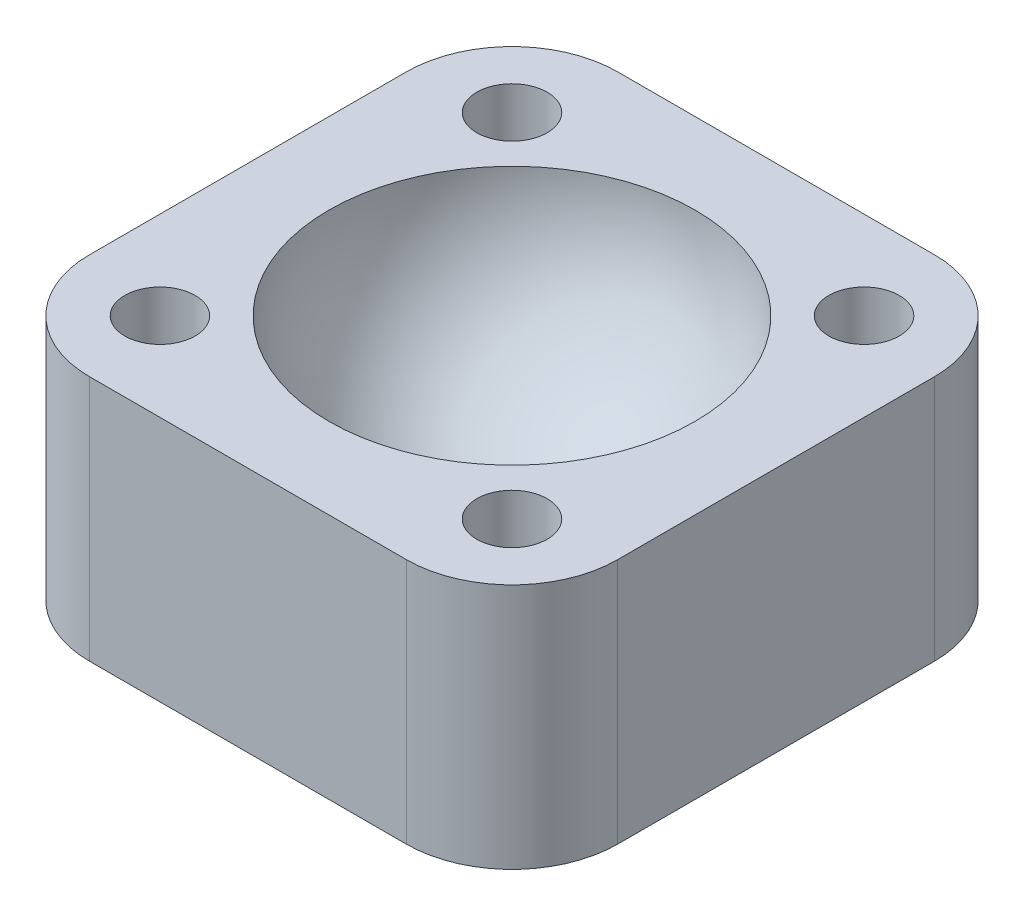
ISO-10303-21;
HEADER;
FILE_DESCRIPTION(('STEP AP214'),'2;1');
FILE_NAME('part.step','',(''),(''),'','','');
FILE_SCHEMA(('AUTOMOTIVE_DESIGN { 1 0 10303 214 1 1 1 1 }'));
ENDSEC;
DATA;
#1=APPLICATION_CONTEXT('core data for automotive mechanical design processes');
#2=APPLICATION_PROTOCOL_DEFINITION('international standard','automotive_design',2000,#1);
#3=PRODUCT_CONTEXT('',#1,'mechanical');
#4=PRODUCT('Part','Part','',(#3));
#5=PRODUCT_RELATED_PRODUCT_CATEGORY('part','',(#4));
#6=PRODUCT_DEFINITION_FORMATION('','',#4);
#7=PRODUCT_DEFINITION_CONTEXT('part definition',#1,'design');
#8=PRODUCT_DEFINITION('design','',#6,#7);
#9=PRODUCT_DEFINITION_SHAPE('','',#8);
#10=(LENGTH_UNIT() NAMED_UNIT(*) SI_UNIT(.MILLI.,.METRE.));
#11=(NAMED_UNIT(*) PLANE_ANGLE_UNIT() SI_UNIT($,.RADIAN.));
#12=(NAMED_UNIT(*) SI_UNIT($,.STERADIAN.) SOLID_ANGLE_UNIT());
#13=UNCERTAINTY_MEASURE_WITH_UNIT(LENGTH_MEASURE(1.E-05),#10,'distance_accuracy_value','');
#14=(GEOMETRIC_REPRESENTATION_CONTEXT(3) GLOBAL_UNCERTAINTY_ASSIGNED_CONTEXT((#13)) GLOBAL_UNIT_ASSIGNED_CONTEXT((#10,
#11,#12)) REPRESENTATION_CONTEXT('',''));
#15=CARTESIAN_POINT('',(0.,0.,0.));
#16=DIRECTION('',(0.,0.,1.));
#17=DIRECTION('',(1.,0.,0.));
#18=AXIS2_PLACEMENT_3D('',#15,#16,#17);
#19=CARTESIAN_POINT('',(0.,7.,0.));
#20=DIRECTION('',(1.,0.,0.));
#21=DIRECTION('',(0.,0.,-1.));
#22=AXIS2_PLACEMENT_3D('',#19,#20,#21);
#23=PLANE('',#22);
#24=DIRECTION('',(0.,0.,1.));
#25=VECTOR('',#24,1.);
#26=CARTESIAN_POINT('',(0.,7.,0.));
#27=LINE('',#26,#25);
#28=CARTESIAN_POINT('',(0.,7.,3.));
#29=VERTEX_POINT('',#28);
#30=CARTESIAN_POINT('',(0.,7.,12.));
#31=VERTEX_POINT('',#30);
#32=EDGE_CURVE('E124',#29,#31,#27,.T.);
#33=ORIENTED_EDGE('',*,*,#32,.F.);
#34=DIRECTION('',(0.,-1.,0.));
#35=VECTOR('',#34,1.);
#36=CARTESIAN_POINT('',(0.,7.,3.));
#37=LINE('',#36,#35);
#38=CARTESIAN_POINT('',(0.,0.,3.));
#39=VERTEX_POINT('',#38);
#40=EDGE_CURVE('E155',#29,#39,#37,.T.);
#41=ORIENTED_EDGE('',*,*,#40,.T.);
#42=DIRECTION('',(0.,0.,1.));
#43=VECTOR('',#42,1.);
#44=CARTESIAN_POINT('',(0.,0.,0.));
#45=LINE('',#44,#43);
#46=CARTESIAN_POINT('',(0.,0.,12.));
#47=VERTEX_POINT('',#46);
#48=EDGE_CURVE('E136',#39,#47,#45,.T.);
#49=ORIENTED_EDGE('',*,*,#48,.T.);
#50=DIRECTION('',(0.,-1.,0.));
#51=VECTOR('',#50,1.);
#52=CARTESIAN_POINT('',(0.,7.,12.));
#53=LINE('',#52,#51);
#54=EDGE_CURVE('E153',#47,#31,#53,.F.);
#55=ORIENTED_EDGE('',*,*,#54,.T.);
#56=EDGE_LOOP('',(#33,#41,#49,#55));
#57=FACE_BOUND('',#56,.T.);
#58=ADVANCED_FACE('F33',(#57),#23,.F.);
#59=CARTESIAN_POINT('',(0.,7.,15.));
#60=DIRECTION('',(0.,0.,-1.));
#61=DIRECTION('',(-1.,0.,0.));
#62=AXIS2_PLACEMENT_3D('',#59,#60,#61);
#63=PLANE('',#62);
#64=DIRECTION('',(1.,0.,0.));
#65=VECTOR('',#64,1.);
#66=CARTESIAN_POINT('',(0.,0.,15.));
#67=LINE('',#66,#65);
#68=CARTESIAN_POINT('',(3.,0.,15.));
#69=VERTEX_POINT('',#68);
#70=CARTESIAN_POINT('',(12.,0.,15.));
#71=VERTEX_POINT('',#70);
#72=EDGE_CURVE('E129',#69,#71,#67,.T.);
#73=ORIENTED_EDGE('',*,*,#72,.T.);
#74=DIRECTION('',(0.,-1.,0.));
#75=VECTOR('',#74,1.);
#76=CARTESIAN_POINT('',(12.,7.,15.));
#77=LINE('',#76,#75);
#78=CARTESIAN_POINT('',(12.,7.,15.));
#79=VERTEX_POINT('',#78);
#80=EDGE_CURVE('E11',#71,#79,#77,.F.);
#81=ORIENTED_EDGE('',*,*,#80,.T.);
#82=DIRECTION('',(1.,0.,0.));
#83=VECTOR('',#82,1.);
#84=CARTESIAN_POINT('',(0.,7.,15.));
#85=LINE('',#84,#83);
#86=CARTESIAN_POINT('',(3.,7.,15.));
#87=VERTEX_POINT('',#86);
#88=EDGE_CURVE('E127',#87,#79,#85,.T.);
#89=ORIENTED_EDGE('',*,*,#88,.F.);
#90=DIRECTION('',(0.,-1.,0.));
#91=VECTOR('',#90,1.);
#92=CARTESIAN_POINT('',(3.,7.,15.));
#93=LINE('',#92,#91);
#94=EDGE_CURVE('E41',#87,#69,#93,.T.);
#95=ORIENTED_EDGE('',*,*,#94,.T.);
#96=EDGE_LOOP('',(#73,#81,#89,#95));
#97=FACE_BOUND('',#96,.T.);
#98=ADVANCED_FACE('F160',(#97),#63,.F.);
#99=CARTESIAN_POINT('',(15.,7.,0.));
#100=DIRECTION('',(-1.,0.,0.));
#101=DIRECTION('',(0.,0.,1.));
#102=AXIS2_PLACEMENT_3D('',#99,#100,#101);
#103=PLANE('',#102);
#104=DIRECTION('',(0.,0.,-1.));
#105=VECTOR('',#104,1.);
#106=CARTESIAN_POINT('',(15.,0.,0.));
#107=LINE('',#106,#105);
#108=CARTESIAN_POINT('',(15.,0.,12.));
#109=VERTEX_POINT('',#108);
#110=CARTESIAN_POINT('',(15.,0.,3.));
#111=VERTEX_POINT('',#110);
#112=EDGE_CURVE('E125',#109,#111,#107,.T.);
#113=ORIENTED_EDGE('',*,*,#112,.T.);
#114=DIRECTION('',(0.,-1.,0.));
#115=VECTOR('',#114,1.);
#116=CARTESIAN_POINT('',(15.,7.,3.));
#117=LINE('',#116,#115);
#118=CARTESIAN_POINT('',(15.,7.,3.));
#119=VERTEX_POINT('',#118);
#120=EDGE_CURVE('E103',#111,#119,#117,.F.);
#121=ORIENTED_EDGE('',*,*,#120,.T.);
#122=DIRECTION('',(0.,0.,-1.));
#123=VECTOR('',#122,1.);
#124=CARTESIAN_POINT('',(15.,7.,0.));
#125=LINE('',#124,#123);
#126=CARTESIAN_POINT('',(15.,7.,12.));
#127=VERTEX_POINT('',#126);
#128=EDGE_CURVE('E166',#127,#119,#125,.T.);
#129=ORIENTED_EDGE('',*,*,#128,.F.);
#130=DIRECTION('',(0.,-1.,0.));
#131=VECTOR('',#130,1.);
#132=CARTESIAN_POINT('',(15.,7.,12.));
#133=LINE('',#132,#131);
#134=EDGE_CURVE('E108',#127,#109,#133,.T.);
#135=ORIENTED_EDGE('',*,*,#134,.T.);
#136=EDGE_LOOP('',(#113,#121,#129,#135));
#137=FACE_BOUND('',#136,.T.);
#138=ADVANCED_FACE('F218',(#137),#103,.F.);
#139=CARTESIAN_POINT('',(0.,7.,0.));
#140=DIRECTION('',(0.,0.,1.));
#141=DIRECTION('',(1.,0.,0.));
#142=AXIS2_PLACEMENT_3D('',#139,#140,#141);
#143=PLANE('',#142);
#144=DIRECTION('',(-1.,0.,0.));
#145=VECTOR('',#144,1.);
#146=CARTESIAN_POINT('',(0.,7.,0.));
#147=LINE('',#146,#145);
#148=CARTESIAN_POINT('',(12.,7.,0.));
#149=VERTEX_POINT('',#148);
#150=CARTESIAN_POINT('',(3.,7.,0.));
#151=VERTEX_POINT('',#150);
#152=EDGE_CURVE('E118',#149,#151,#147,.T.);
#153=ORIENTED_EDGE('',*,*,#152,.F.);
#154=DIRECTION('',(0.,-1.,0.));
#155=VECTOR('',#154,1.);
#156=CARTESIAN_POINT('',(12.,7.,0.));
#157=LINE('',#156,#155);
#158=CARTESIAN_POINT('',(12.,0.,0.));
#159=VERTEX_POINT('',#158);
#160=EDGE_CURVE('E102',#149,#159,#157,.T.);
#161=ORIENTED_EDGE('',*,*,#160,.T.);
#162=DIRECTION('',(-1.,0.,0.));
#163=VECTOR('',#162,1.);
#164=CARTESIAN_POINT('',(0.,0.,0.));
#165=LINE('',#164,#163);
#166=CARTESIAN_POINT('',(3.,0.,0.));
#167=VERTEX_POINT('',#166);
#168=EDGE_CURVE('E115',#159,#167,#165,.T.);
#169=ORIENTED_EDGE('',*,*,#168,.T.);
#170=DIRECTION('',(0.,-1.,0.));
#171=VECTOR('',#170,1.);
#172=CARTESIAN_POINT('',(3.,7.,0.));
#173=LINE('',#172,#171);
#174=EDGE_CURVE('E120',#167,#151,#173,.F.);
#175=ORIENTED_EDGE('',*,*,#174,.T.);
#176=EDGE_LOOP('',(#153,#161,#169,#175));
#177=FACE_BOUND('',#176,.T.);
#178=ADVANCED_FACE('F114',(#177),#143,.F.);
#179=CARTESIAN_POINT('',(0.,7.,0.));
#180=DIRECTION('',(0.,1.,0.));
#181=DIRECTION('',(0.,0.,1.));
#182=AXIS2_PLACEMENT_3D('',#179,#180,#181);
#183=PLANE('',#182);
#184=CARTESIAN_POINT('',(12.5,7.,12.5));
#185=DIRECTION('',(0.,1.,0.));
#186=DIRECTION('',(0.,0.,1.));
#187=AXIS2_PLACEMENT_3D('',#184,#185,#186);
#188=CIRCLE('',#187,1.);
#189=CARTESIAN_POINT('',(12.5,7.,13.5));
#190=VERTEX_POINT('',#189);
#191=EDGE_CURVE('E188',#190,#190,#188,.T.);
#192=ORIENTED_EDGE('',*,*,#191,.F.);
#193=EDGE_LOOP('',(#192));
#194=FACE_BOUND('',#193,.T.);
#195=CARTESIAN_POINT('',(12.5,7.,2.5));
#196=DIRECTION('',(0.,1.,0.));
#197=DIRECTION('',(0.,0.,1.));
#198=AXIS2_PLACEMENT_3D('',#195,#196,#197);
#199=CIRCLE('',#198,1.);
#200=CARTESIAN_POINT('',(12.5,7.,3.5));
#201=VERTEX_POINT('',#200);
#202=EDGE_CURVE('E182',#201,#201,#199,.T.);
#203=ORIENTED_EDGE('',*,*,#202,.F.);
#204=EDGE_LOOP('',(#203));
#205=FACE_BOUND('',#204,.T.);
#206=CARTESIAN_POINT('',(2.49999999999996,7.,2.5));
#207=DIRECTION('',(0.,1.,0.));
#208=DIRECTION('',(0.,0.,1.));
#209=AXIS2_PLACEMENT_3D('',#206,#207,#208);
#210=CIRCLE('',#209,1.);
#211=CARTESIAN_POINT('',(2.49999999999996,7.,3.5));
#212=VERTEX_POINT('',#211);
#213=EDGE_CURVE('E176',#212,#212,#210,.T.);
#214=ORIENTED_EDGE('',*,*,#213,.F.);
#215=EDGE_LOOP('',(#214));
#216=FACE_BOUND('',#215,.T.);
#217=CARTESIAN_POINT('',(2.5,7.,12.5));
#218=DIRECTION('',(0.,1.,0.));
#219=DIRECTION('',(0.,0.,1.));
#220=AXIS2_PLACEMENT_3D('',#217,#218,#219);
#221=CIRCLE('',#220,1.);
#222=CARTESIAN_POINT('',(2.5,7.,13.5));
#223=VERTEX_POINT('',#222);
#224=EDGE_CURVE('E170',#223,#223,#221,.T.);
#225=ORIENTED_EDGE('',*,*,#224,.F.);
#226=EDGE_LOOP('',(#225));
#227=FACE_BOUND('',#226,.T.);
#228=CARTESIAN_POINT('',(7.50000000000001,7.,7.5));
#229=DIRECTION('',(0.,1.,0.));
#230=DIRECTION('',(0.,0.,1.));
#231=AXIS2_PLACEMENT_3D('',#228,#229,#230);
#232=CIRCLE('',#231,5.2);
#233=CARTESIAN_POINT('',(7.50000000000001,7.,12.7));
#234=VERTEX_POINT('',#233);
#235=EDGE_CURVE('E133',#234,#234,#232,.F.);
#236=ORIENTED_EDGE('',*,*,#235,.T.);
#237=EDGE_LOOP('',(#236));
#238=FACE_BOUND('',#237,.T.);
#239=ORIENTED_EDGE('',*,*,#128,.T.);
#240=CARTESIAN_POINT('',(12.,7.,3.));
#241=DIRECTION('',(0.,1.,0.));
#242=DIRECTION('',(0.,0.,1.));
#243=AXIS2_PLACEMENT_3D('',#240,#241,#242);
#244=CIRCLE('',#243,3.);
#245=EDGE_CURVE('E151',#119,#149,#244,.T.);
#246=ORIENTED_EDGE('',*,*,#245,.T.);
#247=ORIENTED_EDGE('',*,*,#152,.T.);
#248=CARTESIAN_POINT('',(3.,7.,3.));
#249=DIRECTION('',(0.,1.,0.));
#250=DIRECTION('',(0.,0.,1.));
#251=AXIS2_PLACEMENT_3D('',#248,#249,#250);
#252=CIRCLE('',#251,3.);
#253=EDGE_CURVE('E149',#151,#29,#252,.T.);
#254=ORIENTED_EDGE('',*,*,#253,.T.);
#255=ORIENTED_EDGE('',*,*,#32,.T.);
#256=CARTESIAN_POINT('',(3.,7.,12.));
#257=DIRECTION('',(0.,1.,0.));
#258=DIRECTION('',(0.,0.,1.));
#259=AXIS2_PLACEMENT_3D('',#256,#257,#258);
#260=CIRCLE('',#259,3.);
#261=EDGE_CURVE('E53',#31,#87,#260,.T.);
#262=ORIENTED_EDGE('',*,*,#261,.T.);
#263=ORIENTED_EDGE('',*,*,#88,.T.);
#264=CARTESIAN_POINT('',(12.,7.,12.));
#265=DIRECTION('',(0.,1.,0.));
#266=DIRECTION('',(0.,0.,1.));
#267=AXIS2_PLACEMENT_3D('',#264,#265,#266);
#268=CIRCLE('',#267,3.);
#269=EDGE_CURVE('E147',#79,#127,#268,.T.);
#270=ORIENTED_EDGE('',*,*,#269,.T.);
#271=EDGE_LOOP('',(#239,#246,#247,#254,#255,#262,#263,#270));
#272=FACE_BOUND('',#271,.T.);
#273=ADVANCED_FACE('F203',(#194,#205,#216,#227,#238,#272),#183,.T.);
#274=CARTESIAN_POINT('',(0.,0.,0.));
#275=DIRECTION('',(0.,1.,0.));
#276=DIRECTION('',(0.,0.,1.));
#277=AXIS2_PLACEMENT_3D('',#274,#275,#276);
#278=PLANE('',#277);
#279=CARTESIAN_POINT('',(12.5,0.,12.5));
#280=DIRECTION('',(0.,1.,0.));
#281=DIRECTION('',(0.,0.,1.));
#282=AXIS2_PLACEMENT_3D('',#279,#280,#281);
#283=CIRCLE('',#282,1.);
#284=CARTESIAN_POINT('',(12.5,0.,13.5));
#285=VERTEX_POINT('',#284);
#286=EDGE_CURVE('E173',#285,#285,#283,.T.);
#287=ORIENTED_EDGE('',*,*,#286,.T.);
#288=EDGE_LOOP('',(#287));
#289=FACE_BOUND('',#288,.T.);
#290=CARTESIAN_POINT('',(12.5,0.,2.5));
#291=DIRECTION('',(0.,1.,0.));
#292=DIRECTION('',(0.,0.,1.));
#293=AXIS2_PLACEMENT_3D('',#290,#291,#292);
#294=CIRCLE('',#293,1.);
#295=CARTESIAN_POINT('',(12.5,0.,3.5));
#296=VERTEX_POINT('',#295);
#297=EDGE_CURVE('E185',#296,#296,#294,.T.);
#298=ORIENTED_EDGE('',*,*,#297,.T.);
#299=EDGE_LOOP('',(#298));
#300=FACE_BOUND('',#299,.T.);
#301=CARTESIAN_POINT('',(2.49999999999996,0.,2.5));
#302=DIRECTION('',(0.,1.,0.));
#303=DIRECTION('',(0.,0.,1.));
#304=AXIS2_PLACEMENT_3D('',#301,#302,#303);
#305=CIRCLE('',#304,1.);
#306=CARTESIAN_POINT('',(2.49999999999996,0.,3.5));
#307=VERTEX_POINT('',#306);
#308=EDGE_CURVE('E179',#307,#307,#305,.T.);
#309=ORIENTED_EDGE('',*,*,#308,.T.);
#310=EDGE_LOOP('',(#309));
#311=FACE_BOUND('',#310,.T.);
#312=CARTESIAN_POINT('',(2.5,0.,12.5));
#313=DIRECTION('',(0.,1.,0.));
#314=DIRECTION('',(0.,0.,1.));
#315=AXIS2_PLACEMENT_3D('',#312,#313,#314);
#316=CIRCLE('',#315,1.);
#317=CARTESIAN_POINT('',(2.5,0.,13.5));
#318=VERTEX_POINT('',#317);
#319=EDGE_CURVE('E137',#318,#318,#316,.T.);
#320=ORIENTED_EDGE('',*,*,#319,.T.);
#321=EDGE_LOOP('',(#320));
#322=FACE_BOUND('',#321,.T.);
#323=ORIENTED_EDGE('',*,*,#168,.F.);
#324=CARTESIAN_POINT('',(12.,0.,3.));
#325=DIRECTION('',(0.,1.,0.));
#326=DIRECTION('',(0.,0.,1.));
#327=AXIS2_PLACEMENT_3D('',#324,#325,#326);
#328=CIRCLE('',#327,3.);
#329=EDGE_CURVE('E98',#159,#111,#328,.F.);
#330=ORIENTED_EDGE('',*,*,#329,.T.);
#331=ORIENTED_EDGE('',*,*,#112,.F.);
#332=CARTESIAN_POINT('',(12.,0.,12.));
#333=DIRECTION('',(0.,1.,0.));
#334=DIRECTION('',(0.,0.,1.));
#335=AXIS2_PLACEMENT_3D('',#332,#333,#334);
#336=CIRCLE('',#335,3.);
#337=EDGE_CURVE('E140',#109,#71,#336,.F.);
#338=ORIENTED_EDGE('',*,*,#337,.T.);
#339=ORIENTED_EDGE('',*,*,#72,.F.);
#340=CARTESIAN_POINT('',(3.,0.,12.));
#341=DIRECTION('',(0.,1.,0.));
#342=DIRECTION('',(0.,0.,1.));
#343=AXIS2_PLACEMENT_3D('',#340,#341,#342);
#344=CIRCLE('',#343,3.);
#345=EDGE_CURVE('E119',#69,#47,#344,.F.);
#346=ORIENTED_EDGE('',*,*,#345,.T.);
#347=ORIENTED_EDGE('',*,*,#48,.F.);
#348=CARTESIAN_POINT('',(3.,0.,3.));
#349=DIRECTION('',(0.,1.,0.));
#350=DIRECTION('',(0.,0.,1.));
#351=AXIS2_PLACEMENT_3D('',#348,#349,#350);
#352=CIRCLE('',#351,3.);
#353=EDGE_CURVE('E109',#39,#167,#352,.F.);
#354=ORIENTED_EDGE('',*,*,#353,.T.);
#355=EDGE_LOOP('',(#323,#330,#331,#338,#339,#346,#347,#354));
#356=FACE_BOUND('',#355,.T.);
#357=ADVANCED_FACE('F122',(#289,#300,#311,#322,#356),#278,.F.);
#358=CARTESIAN_POINT('',(7.50000000000001,7.,7.5));
#359=DIRECTION('',(1.,0.,0.));
#360=DIRECTION('',(0.,0.,1.));
#361=AXIS2_PLACEMENT_3D('',#358,#359,#360);
#362=SPHERICAL_SURFACE('',#361,5.2);
#363=CARTESIAN_POINT('',(7.50000000000001,7.,7.5));
#364=DIRECTION('',(0.,1.,0.));
#365=DIRECTION('',(0.,0.,1.));
#366=AXIS2_PLACEMENT_3D('',#363,#364,#365);
#367=SPHERICAL_SURFACE('',#366,5.2);
#368=ORIENTED_EDGE('',*,*,#235,.F.);
#369=EDGE_LOOP('',(#368));
#370=FACE_BOUND('',#369,.T.);
#371=ADVANCED_FACE('F293',(#370),#367,.F.);
#372=CARTESIAN_POINT('',(2.5,0.,12.5));
#373=DIRECTION('',(0.,1.,0.));
#374=DIRECTION('',(0.,0.,1.));
#375=AXIS2_PLACEMENT_3D('',#372,#373,#374);
#376=CYLINDRICAL_SURFACE('',#375,1.);
#377=ORIENTED_EDGE('',*,*,#319,.F.);
#378=EDGE_LOOP('',(#377));
#379=FACE_BOUND('',#378,.T.);
#380=ORIENTED_EDGE('',*,*,#224,.T.);
#381=EDGE_LOOP('',(#380));
#382=FACE_BOUND('',#381,.T.);
#383=ADVANCED_FACE('F284',(#379,#382),#376,.F.);
#384=CARTESIAN_POINT('',(2.49999999999996,0.,2.5));
#385=DIRECTION('',(0.,1.,0.));
#386=DIRECTION('',(0.,0.,1.));
#387=AXIS2_PLACEMENT_3D('',#384,#385,#386);
#388=CYLINDRICAL_SURFACE('',#387,1.);
#389=ORIENTED_EDGE('',*,*,#308,.F.);
#390=EDGE_LOOP('',(#389));
#391=FACE_BOUND('',#390,.T.);
#392=ORIENTED_EDGE('',*,*,#213,.T.);
#393=EDGE_LOOP('',(#392));
#394=FACE_BOUND('',#393,.T.);
#395=ADVANCED_FACE('F275',(#391,#394),#388,.F.);
#396=CARTESIAN_POINT('',(12.5,0.,2.5));
#397=DIRECTION('',(0.,1.,0.));
#398=DIRECTION('',(0.,0.,1.));
#399=AXIS2_PLACEMENT_3D('',#396,#397,#398);
#400=CYLINDRICAL_SURFACE('',#399,1.);
#401=ORIENTED_EDGE('',*,*,#297,.F.);
#402=EDGE_LOOP('',(#401));
#403=FACE_BOUND('',#402,.T.);
#404=ORIENTED_EDGE('',*,*,#202,.T.);
#405=EDGE_LOOP('',(#404));
#406=FACE_BOUND('',#405,.T.);
#407=ADVANCED_FACE('F199',(#403,#406),#400,.F.);
#408=CARTESIAN_POINT('',(12.5,0.,12.5));
#409=DIRECTION('',(0.,1.,0.));
#410=DIRECTION('',(0.,0.,1.));
#411=AXIS2_PLACEMENT_3D('',#408,#409,#410);
#412=CYLINDRICAL_SURFACE('',#411,1.);
#413=ORIENTED_EDGE('',*,*,#286,.F.);
#414=EDGE_LOOP('',(#413));
#415=FACE_BOUND('',#414,.T.);
#416=ORIENTED_EDGE('',*,*,#191,.T.);
#417=EDGE_LOOP('',(#416));
#418=FACE_BOUND('',#417,.T.);
#419=ADVANCED_FACE('F196',(#415,#418),#412,.F.);
#420=CARTESIAN_POINT('',(12.,7.,3.));
#421=DIRECTION('',(0.,-1.,0.));
#422=DIRECTION('',(0.,0.,-1.));
#423=AXIS2_PLACEMENT_3D('',#420,#421,#422);
#424=CYLINDRICAL_SURFACE('',#423,3.);
#425=ORIENTED_EDGE('',*,*,#245,.F.);
#426=ORIENTED_EDGE('',*,*,#120,.F.);
#427=ORIENTED_EDGE('',*,*,#329,.F.);
#428=ORIENTED_EDGE('',*,*,#160,.F.);
#429=EDGE_LOOP('',(#425,#426,#427,#428));
#430=FACE_BOUND('',#429,.T.);
#431=ADVANCED_FACE('F101',(#430),#424,.T.);
#432=CARTESIAN_POINT('',(3.,7.,3.));
#433=DIRECTION('',(0.,-1.,0.));
#434=DIRECTION('',(0.,0.,-1.));
#435=AXIS2_PLACEMENT_3D('',#432,#433,#434);
#436=CYLINDRICAL_SURFACE('',#435,3.);
#437=ORIENTED_EDGE('',*,*,#253,.F.);
#438=ORIENTED_EDGE('',*,*,#174,.F.);
#439=ORIENTED_EDGE('',*,*,#353,.F.);
#440=ORIENTED_EDGE('',*,*,#40,.F.);
#441=EDGE_LOOP('',(#437,#438,#439,#440));
#442=FACE_BOUND('',#441,.T.);
#443=ADVANCED_FACE('F222',(#442),#436,.T.);
#444=CARTESIAN_POINT('',(12.,7.,12.));
#445=DIRECTION('',(0.,-1.,0.));
#446=DIRECTION('',(0.,0.,-1.));
#447=AXIS2_PLACEMENT_3D('',#444,#445,#446);
#448=CYLINDRICAL_SURFACE('',#447,3.);
#449=ORIENTED_EDGE('',*,*,#269,.F.);
#450=ORIENTED_EDGE('',*,*,#80,.F.);
#451=ORIENTED_EDGE('',*,*,#337,.F.);
#452=ORIENTED_EDGE('',*,*,#134,.F.);
#453=EDGE_LOOP('',(#449,#450,#451,#452));
#454=FACE_BOUND('',#453,.T.);
#455=ADVANCED_FACE('F220',(#454),#448,.T.);
#456=CARTESIAN_POINT('',(3.,7.,12.));
#457=DIRECTION('',(0.,-1.,0.));
#458=DIRECTION('',(0.,0.,-1.));
#459=AXIS2_PLACEMENT_3D('',#456,#457,#458);
#460=CYLINDRICAL_SURFACE('',#459,3.);
#461=ORIENTED_EDGE('',*,*,#261,.F.);
#462=ORIENTED_EDGE('',*,*,#54,.F.);
#463=ORIENTED_EDGE('',*,*,#345,.F.);
#464=ORIENTED_EDGE('',*,*,#94,.F.);
#465=EDGE_LOOP('',(#461,#462,#463,#464));
#466=FACE_BOUND('',#465,.T.);
#467=ADVANCED_FACE('F35',(#466),#460,.T.);
#468=CLOSED_SHELL('',(#58,#98,#138,#178,#273,#357,#371,#383,#395,#407,#419,#431,#443,#455,#467));
#469=MANIFOLD_SOLID_BREP('B2',#468);
#470=ADVANCED_BREP_SHAPE_REPRESENTATION('',(#18,#469),#14);
#471=SHAPE_DEFINITION_REPRESENTATION(#9,#470);
ENDSEC;
END-ISO-10303-21;
